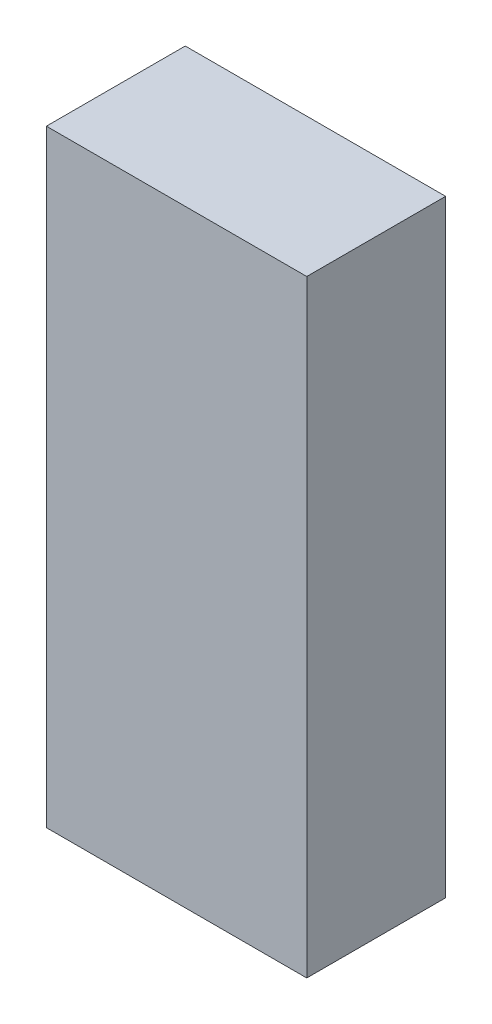
ISO-10303-21;
HEADER;
FILE_DESCRIPTION(('STEP AP214'),'2;1');
FILE_NAME('part.step','',(''),(''),'','','');
FILE_SCHEMA(('AUTOMOTIVE_DESIGN { 1 0 10303 214 1 1 1 1 }'));
ENDSEC;
DATA;
#1=APPLICATION_CONTEXT('core data for automotive mechanical design processes');
#2=APPLICATION_PROTOCOL_DEFINITION('international standard','automotive_design',2000,#1);
#3=PRODUCT_CONTEXT('',#1,'mechanical');
#4=PRODUCT('Part','Part','',(#3));
#5=PRODUCT_RELATED_PRODUCT_CATEGORY('part','',(#4));
#6=PRODUCT_DEFINITION_FORMATION('','',#4);
#7=PRODUCT_DEFINITION_CONTEXT('part definition',#1,'design');
#8=PRODUCT_DEFINITION('design','',#6,#7);
#9=PRODUCT_DEFINITION_SHAPE('','',#8);
#10=(LENGTH_UNIT() NAMED_UNIT(*) SI_UNIT(.MILLI.,.METRE.));
#11=(NAMED_UNIT(*) PLANE_ANGLE_UNIT() SI_UNIT($,.RADIAN.));
#12=(NAMED_UNIT(*) SI_UNIT($,.STERADIAN.) SOLID_ANGLE_UNIT());
#13=UNCERTAINTY_MEASURE_WITH_UNIT(LENGTH_MEASURE(1.E-05),#10,'distance_accuracy_value','');
#14=(GEOMETRIC_REPRESENTATION_CONTEXT(3) GLOBAL_UNCERTAINTY_ASSIGNED_CONTEXT((#13)) GLOBAL_UNIT_ASSIGNED_CONTEXT((#10,
#11,#12)) REPRESENTATION_CONTEXT('',''));
#15=CARTESIAN_POINT('',(0.,0.,0.));
#16=DIRECTION('',(0.,0.,1.));
#17=DIRECTION('',(1.,0.,0.));
#18=AXIS2_PLACEMENT_3D('',#15,#16,#17);
#19=CARTESIAN_POINT('',(-3.74999999999994,-17.5000000000001,4.));
#20=DIRECTION('',(1.,0.,0.));
#21=DIRECTION('',(0.,0.,-1.));
#22=AXIS2_PLACEMENT_3D('',#19,#20,#21);
#23=PLANE('',#22);
#24=DIRECTION('',(0.,-1.,0.));
#25=VECTOR('',#24,1.);
#26=CARTESIAN_POINT('',(-3.74999999999994,-17.5000000000001,0.));
#27=LINE('',#26,#25);
#28=CARTESIAN_POINT('',(-3.74999999999994,0.,0.));
#29=VERTEX_POINT('',#28);
#30=CARTESIAN_POINT('',(-3.74999999999994,-17.5000000000001,0.));
#31=VERTEX_POINT('',#30);
#32=EDGE_CURVE('E101',#29,#31,#27,.T.);
#33=ORIENTED_EDGE('',*,*,#32,.T.);
#34=DIRECTION('',(0.,0.,-1.));
#35=VECTOR('',#34,1.);
#36=CARTESIAN_POINT('',(-3.74999999999994,-17.5000000000001,4.));
#37=LINE('',#36,#35);
#38=CARTESIAN_POINT('',(-3.74999999999994,-17.5000000000001,4.));
#39=VERTEX_POINT('',#38);
#40=EDGE_CURVE('E11',#39,#31,#37,.T.);
#41=ORIENTED_EDGE('',*,*,#40,.F.);
#42=DIRECTION('',(0.,-1.,0.));
#43=VECTOR('',#42,1.);
#44=CARTESIAN_POINT('',(-3.74999999999994,-17.5000000000001,4.));
#45=LINE('',#44,#43);
#46=CARTESIAN_POINT('',(-3.74999999999994,0.,4.));
#47=VERTEX_POINT('',#46);
#48=EDGE_CURVE('E89',#47,#39,#45,.T.);
#49=ORIENTED_EDGE('',*,*,#48,.F.);
#50=DIRECTION('',(0.,0.,-1.));
#51=VECTOR('',#50,1.);
#52=CARTESIAN_POINT('',(-3.74999999999994,0.,4.));
#53=LINE('',#52,#51);
#54=EDGE_CURVE('E97',#47,#29,#53,.T.);
#55=ORIENTED_EDGE('',*,*,#54,.T.);
#56=EDGE_LOOP('',(#33,#41,#49,#55));
#57=FACE_BOUND('',#56,.T.);
#58=ADVANCED_FACE('F38',(#57),#23,.F.);
#59=CARTESIAN_POINT('',(-3.74999999999994,-17.5000000000001,4.));
#60=DIRECTION('',(0.,1.,0.));
#61=DIRECTION('',(0.,0.,1.));
#62=AXIS2_PLACEMENT_3D('',#59,#60,#61);
#63=PLANE('',#62);
#64=DIRECTION('',(1.,0.,0.));
#65=VECTOR('',#64,1.);
#66=CARTESIAN_POINT('',(-3.74999999999994,-17.5000000000001,0.));
#67=LINE('',#66,#65);
#68=CARTESIAN_POINT('',(3.75000000000006,-17.5000000000001,0.));
#69=VERTEX_POINT('',#68);
#70=EDGE_CURVE('E93',#31,#69,#67,.T.);
#71=ORIENTED_EDGE('',*,*,#70,.T.);
#72=DIRECTION('',(0.,0.,-1.));
#73=VECTOR('',#72,1.);
#74=CARTESIAN_POINT('',(3.75000000000006,-17.5000000000001,4.));
#75=LINE('',#74,#73);
#76=CARTESIAN_POINT('',(3.75000000000006,-17.5000000000001,4.));
#77=VERTEX_POINT('',#76);
#78=EDGE_CURVE('E46',#77,#69,#75,.T.);
#79=ORIENTED_EDGE('',*,*,#78,.F.);
#80=DIRECTION('',(1.,0.,0.));
#81=VECTOR('',#80,1.);
#82=CARTESIAN_POINT('',(-3.74999999999994,-17.5000000000001,4.));
#83=LINE('',#82,#81);
#84=EDGE_CURVE('E84',#39,#77,#83,.T.);
#85=ORIENTED_EDGE('',*,*,#84,.F.);
#86=ORIENTED_EDGE('',*,*,#40,.T.);
#87=EDGE_LOOP('',(#71,#79,#85,#86));
#88=FACE_BOUND('',#87,.T.);
#89=ADVANCED_FACE('F92',(#88),#63,.F.);
#90=CARTESIAN_POINT('',(3.75000000000006,-17.5000000000001,4.));
#91=DIRECTION('',(-1.,0.,0.));
#92=DIRECTION('',(0.,0.,1.));
#93=AXIS2_PLACEMENT_3D('',#90,#91,#92);
#94=PLANE('',#93);
#95=DIRECTION('',(0.,1.,0.));
#96=VECTOR('',#95,1.);
#97=CARTESIAN_POINT('',(3.75000000000006,-17.5000000000001,0.));
#98=LINE('',#97,#96);
#99=CARTESIAN_POINT('',(3.75000000000006,0.,0.));
#100=VERTEX_POINT('',#99);
#101=EDGE_CURVE('E71',#69,#100,#98,.T.);
#102=ORIENTED_EDGE('',*,*,#101,.T.);
#103=DIRECTION('',(0.,0.,-1.));
#104=VECTOR('',#103,1.);
#105=CARTESIAN_POINT('',(3.75000000000006,0.,4.));
#106=LINE('',#105,#104);
#107=CARTESIAN_POINT('',(3.75000000000006,0.,4.));
#108=VERTEX_POINT('',#107);
#109=EDGE_CURVE('E94',#108,#100,#106,.T.);
#110=ORIENTED_EDGE('',*,*,#109,.F.);
#111=DIRECTION('',(0.,1.,0.));
#112=VECTOR('',#111,1.);
#113=CARTESIAN_POINT('',(3.75000000000006,-17.5000000000001,4.));
#114=LINE('',#113,#112);
#115=EDGE_CURVE('E87',#77,#108,#114,.T.);
#116=ORIENTED_EDGE('',*,*,#115,.F.);
#117=ORIENTED_EDGE('',*,*,#78,.T.);
#118=EDGE_LOOP('',(#102,#110,#116,#117));
#119=FACE_BOUND('',#118,.T.);
#120=ADVANCED_FACE('F95',(#119),#94,.F.);
#121=CARTESIAN_POINT('',(-3.74999999999994,0.,4.));
#122=DIRECTION('',(0.,-1.,0.));
#123=DIRECTION('',(0.,0.,-1.));
#124=AXIS2_PLACEMENT_3D('',#121,#122,#123);
#125=PLANE('',#124);
#126=DIRECTION('',(-1.,0.,0.));
#127=VECTOR('',#126,1.);
#128=CARTESIAN_POINT('',(-3.74999999999994,0.,0.));
#129=LINE('',#128,#127);
#130=EDGE_CURVE('E77',#100,#29,#129,.T.);
#131=ORIENTED_EDGE('',*,*,#130,.T.);
#132=ORIENTED_EDGE('',*,*,#54,.F.);
#133=DIRECTION('',(-1.,0.,0.));
#134=VECTOR('',#133,1.);
#135=CARTESIAN_POINT('',(-3.74999999999994,0.,4.));
#136=LINE('',#135,#134);
#137=EDGE_CURVE('E54',#108,#47,#136,.T.);
#138=ORIENTED_EDGE('',*,*,#137,.F.);
#139=ORIENTED_EDGE('',*,*,#109,.T.);
#140=EDGE_LOOP('',(#131,#132,#138,#139));
#141=FACE_BOUND('',#140,.T.);
#142=ADVANCED_FACE('F108',(#141),#125,.F.);
#143=CARTESIAN_POINT('',(0.,0.,4.));
#144=DIRECTION('',(0.,0.,-1.));
#145=DIRECTION('',(-1.,0.,0.));
#146=AXIS2_PLACEMENT_3D('',#143,#144,#145);
#147=PLANE('',#146);
#148=ORIENTED_EDGE('',*,*,#48,.T.);
#149=ORIENTED_EDGE('',*,*,#84,.T.);
#150=ORIENTED_EDGE('',*,*,#115,.T.);
#151=ORIENTED_EDGE('',*,*,#137,.T.);
#152=EDGE_LOOP('',(#148,#149,#150,#151));
#153=FACE_BOUND('',#152,.T.);
#154=ADVANCED_FACE('F85',(#153),#147,.F.);
#155=CARTESIAN_POINT('',(0.,0.,0.));
#156=DIRECTION('',(0.,0.,-1.));
#157=DIRECTION('',(-1.,0.,0.));
#158=AXIS2_PLACEMENT_3D('',#155,#156,#157);
#159=PLANE('',#158);
#160=ORIENTED_EDGE('',*,*,#32,.F.);
#161=ORIENTED_EDGE('',*,*,#130,.F.);
#162=ORIENTED_EDGE('',*,*,#101,.F.);
#163=ORIENTED_EDGE('',*,*,#70,.F.);
#164=EDGE_LOOP('',(#160,#161,#162,#163));
#165=FACE_BOUND('',#164,.T.);
#166=ADVANCED_FACE('F111',(#165),#159,.T.);
#167=CLOSED_SHELL('',(#58,#89,#120,#142,#154,#166));
#168=MANIFOLD_SOLID_BREP('B2',#167);
#169=ADVANCED_BREP_SHAPE_REPRESENTATION('',(#18,#168),#14);
#170=SHAPE_DEFINITION_REPRESENTATION(#9,#169);
ENDSEC;
END-ISO-10303-21;
